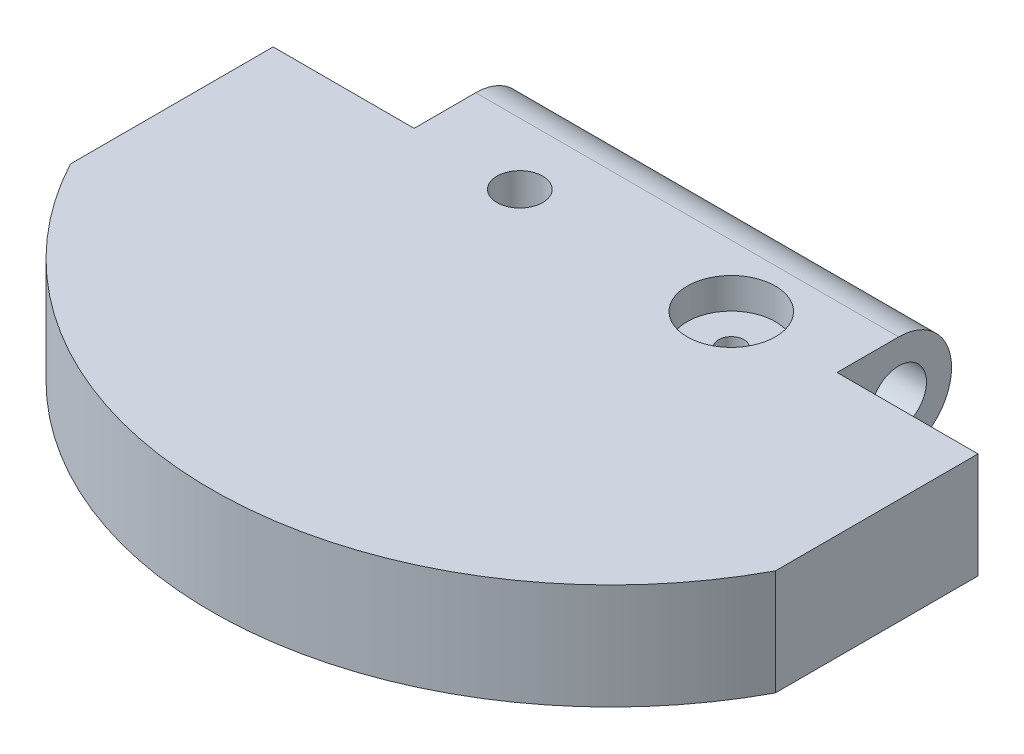
ISO-10303-21;
HEADER;
FILE_DESCRIPTION(('STEP AP214'),'2;1');
FILE_NAME('part.step','',(''),(''),'','','');
FILE_SCHEMA(('AUTOMOTIVE_DESIGN { 1 0 10303 214 1 1 1 1 }'));
ENDSEC;
DATA;
#1=APPLICATION_CONTEXT('core data for automotive mechanical design processes');
#2=APPLICATION_PROTOCOL_DEFINITION('international standard','automotive_design',2000,#1);
#3=PRODUCT_CONTEXT('',#1,'mechanical');
#4=PRODUCT('Part','Part','',(#3));
#5=PRODUCT_RELATED_PRODUCT_CATEGORY('part','',(#4));
#6=PRODUCT_DEFINITION_FORMATION('','',#4);
#7=PRODUCT_DEFINITION_CONTEXT('part definition',#1,'design');
#8=PRODUCT_DEFINITION('design','',#6,#7);
#9=PRODUCT_DEFINITION_SHAPE('','',#8);
#10=(LENGTH_UNIT() NAMED_UNIT(*) SI_UNIT(.MILLI.,.METRE.));
#11=(NAMED_UNIT(*) PLANE_ANGLE_UNIT() SI_UNIT($,.RADIAN.));
#12=(NAMED_UNIT(*) SI_UNIT($,.STERADIAN.) SOLID_ANGLE_UNIT());
#13=UNCERTAINTY_MEASURE_WITH_UNIT(LENGTH_MEASURE(1.E-05),#10,'distance_accuracy_value','');
#14=(GEOMETRIC_REPRESENTATION_CONTEXT(3) GLOBAL_UNCERTAINTY_ASSIGNED_CONTEXT((#13)) GLOBAL_UNIT_ASSIGNED_CONTEXT((#10,
#11,#12)) REPRESENTATION_CONTEXT('',''));
#15=CARTESIAN_POINT('',(0.,0.,0.));
#16=DIRECTION('',(0.,0.,1.));
#17=DIRECTION('',(1.,0.,0.));
#18=AXIS2_PLACEMENT_3D('',#15,#16,#17);
#19=CARTESIAN_POINT('',(-12.,-1.5,-17.));
#20=DIRECTION('',(0.,1.,0.));
#21=DIRECTION('',(0.,0.,1.));
#22=AXIS2_PLACEMENT_3D('',#19,#20,#21);
#23=CYLINDRICAL_SURFACE('',#22,1.45);
#24=CARTESIAN_POINT('',(-12.,3.5,-17.));
#25=DIRECTION('',(0.,1.,0.));
#26=DIRECTION('',(0.,0.,1.));
#27=AXIS2_PLACEMENT_3D('',#24,#25,#26);
#28=CIRCLE('',#27,1.45);
#29=CARTESIAN_POINT('',(-12.,3.5,-15.55));
#30=VERTEX_POINT('',#29);
#31=EDGE_CURVE('E169',#30,#30,#28,.T.);
#32=ORIENTED_EDGE('',*,*,#31,.F.);
#33=EDGE_LOOP('',(#32));
#34=FACE_BOUND('',#33,.T.);
#35=CARTESIAN_POINT('',(-12.,7.6,-17.));
#36=DIRECTION('',(0.,1.,0.));
#37=DIRECTION('',(0.,0.,1.));
#38=AXIS2_PLACEMENT_3D('',#35,#36,#37);
#39=CIRCLE('',#38,1.45);
#40=CARTESIAN_POINT('',(-12.,7.6,-15.55));
#41=VERTEX_POINT('',#40);
#42=EDGE_CURVE('E174',#41,#41,#39,.F.);
#43=ORIENTED_EDGE('',*,*,#42,.F.);
#44=EDGE_LOOP('',(#43));
#45=FACE_BOUND('',#44,.T.);
#46=ADVANCED_FACE('F44',(#34,#45),#23,.F.);
#47=CARTESIAN_POINT('',(0.,12.,-15.3333333333333));
#48=DIRECTION('',(0.,-1.,0.));
#49=DIRECTION('',(0.,0.,-1.));
#50=AXIS2_PLACEMENT_3D('',#47,#48,#49);
#51=CYLINDRICAL_SURFACE('',#50,45.3333333333333);
#52=CARTESIAN_POINT('',(0.,0.,-15.3333333333333));
#53=DIRECTION('',(0.,1.,0.));
#54=DIRECTION('',(0.,0.,1.));
#55=AXIS2_PLACEMENT_3D('',#52,#53,#54);
#56=CIRCLE('',#55,45.3333333333333);
#57=CARTESIAN_POINT('',(-40.,0.,5.99999999999999));
#58=VERTEX_POINT('',#57);
#59=CARTESIAN_POINT('',(40.,0.,5.99999999999999));
#60=VERTEX_POINT('',#59);
#61=EDGE_CURVE('E142',#58,#60,#56,.T.);
#62=ORIENTED_EDGE('',*,*,#61,.T.);
#63=DIRECTION('',(0.,-1.,0.));
#64=VECTOR('',#63,1.);
#65=CARTESIAN_POINT('',(40.,12.,5.99999999999999));
#66=LINE('',#65,#64);
#67=CARTESIAN_POINT('',(40.,12.,5.99999999999999));
#68=VERTEX_POINT('',#67);
#69=EDGE_CURVE('E122',#68,#60,#66,.T.);
#70=ORIENTED_EDGE('',*,*,#69,.F.);
#71=CARTESIAN_POINT('',(0.,12.,-15.3333333333333));
#72=DIRECTION('',(0.,1.,0.));
#73=DIRECTION('',(0.,0.,1.));
#74=AXIS2_PLACEMENT_3D('',#71,#72,#73);
#75=CIRCLE('',#74,45.3333333333333);
#76=CARTESIAN_POINT('',(-40.,12.,5.99999999999999));
#77=VERTEX_POINT('',#76);
#78=EDGE_CURVE('E129',#77,#68,#75,.T.);
#79=ORIENTED_EDGE('',*,*,#78,.F.);
#80=DIRECTION('',(0.,-1.,0.));
#81=VECTOR('',#80,1.);
#82=CARTESIAN_POINT('',(-40.,12.,5.99999999999999));
#83=LINE('',#82,#81);
#84=EDGE_CURVE('E240',#77,#58,#83,.T.);
#85=ORIENTED_EDGE('',*,*,#84,.T.);
#86=EDGE_LOOP('',(#62,#70,#79,#85));
#87=FACE_BOUND('',#86,.T.);
#88=ADVANCED_FACE('F140',(#87),#51,.T.);
#89=CARTESIAN_POINT('',(40.,12.,0.));
#90=DIRECTION('',(-1.,0.,0.));
#91=DIRECTION('',(0.,0.,1.));
#92=AXIS2_PLACEMENT_3D('',#89,#90,#91);
#93=PLANE('',#92);
#94=DIRECTION('',(0.,0.,-1.));
#95=VECTOR('',#94,1.);
#96=CARTESIAN_POINT('',(40.,0.,0.));
#97=LINE('',#96,#95);
#98=CARTESIAN_POINT('',(40.,0.,-17.));
#99=VERTEX_POINT('',#98);
#100=EDGE_CURVE('E243',#60,#99,#97,.T.);
#101=ORIENTED_EDGE('',*,*,#100,.T.);
#102=DIRECTION('',(0.,-1.,0.));
#103=VECTOR('',#102,1.);
#104=CARTESIAN_POINT('',(40.,12.,-17.));
#105=LINE('',#104,#103);
#106=CARTESIAN_POINT('',(40.,12.,-17.));
#107=VERTEX_POINT('',#106);
#108=EDGE_CURVE('E124',#107,#99,#105,.T.);
#109=ORIENTED_EDGE('',*,*,#108,.F.);
#110=DIRECTION('',(0.,0.,-1.));
#111=VECTOR('',#110,1.);
#112=CARTESIAN_POINT('',(40.,12.,0.));
#113=LINE('',#112,#111);
#114=EDGE_CURVE('E117',#68,#107,#113,.T.);
#115=ORIENTED_EDGE('',*,*,#114,.F.);
#116=ORIENTED_EDGE('',*,*,#69,.T.);
#117=EDGE_LOOP('',(#101,#109,#115,#116));
#118=FACE_BOUND('',#117,.T.);
#119=ADVANCED_FACE('F120',(#118),#93,.F.);
#120=CARTESIAN_POINT('',(0.,12.,-17.));
#121=DIRECTION('',(0.,0.,-1.));
#122=DIRECTION('',(-1.,0.,0.));
#123=AXIS2_PLACEMENT_3D('',#120,#121,#122);
#124=PLANE('',#123);
#125=DIRECTION('',(1.,0.,0.));
#126=VECTOR('',#125,1.);
#127=CARTESIAN_POINT('',(0.,0.,-17.));
#128=LINE('',#127,#126);
#129=CARTESIAN_POINT('',(24.,0.,-17.));
#130=VERTEX_POINT('',#129);
#131=EDGE_CURVE('E246',#130,#99,#128,.T.);
#132=ORIENTED_EDGE('',*,*,#131,.F.);
#133=DIRECTION('',(0.,-1.,0.));
#134=VECTOR('',#133,1.);
#135=CARTESIAN_POINT('',(24.,12.,-17.));
#136=LINE('',#135,#134);
#137=CARTESIAN_POINT('',(24.,12.,-17.));
#138=VERTEX_POINT('',#137);
#139=EDGE_CURVE('E151',#138,#130,#136,.T.);
#140=ORIENTED_EDGE('',*,*,#139,.F.);
#141=DIRECTION('',(1.,0.,0.));
#142=VECTOR('',#141,1.);
#143=CARTESIAN_POINT('',(0.,12.,-17.));
#144=LINE('',#143,#142);
#145=EDGE_CURVE('E128',#138,#107,#144,.T.);
#146=ORIENTED_EDGE('',*,*,#145,.T.);
#147=ORIENTED_EDGE('',*,*,#108,.T.);
#148=EDGE_LOOP('',(#132,#140,#146,#147));
#149=FACE_BOUND('',#148,.T.);
#150=ADVANCED_FACE('F279',(#149),#124,.T.);
#151=CARTESIAN_POINT('',(24.,12.,0.));
#152=DIRECTION('',(1.,0.,0.));
#153=DIRECTION('',(0.,0.,-1.));
#154=AXIS2_PLACEMENT_3D('',#151,#152,#153);
#155=PLANE('',#154);
#156=CARTESIAN_POINT('',(24.,6.,-24.));
#157=DIRECTION('',(1.,0.,0.));
#158=DIRECTION('',(0.,0.,-1.));
#159=AXIS2_PLACEMENT_3D('',#156,#157,#158);
#160=CIRCLE('',#159,3.15);
#161=CARTESIAN_POINT('',(24.,6.,-27.15));
#162=VERTEX_POINT('',#161);
#163=EDGE_CURVE('E168',#162,#162,#160,.T.);
#164=ORIENTED_EDGE('',*,*,#163,.F.);
#165=EDGE_LOOP('',(#164));
#166=FACE_BOUND('',#165,.T.);
#167=DIRECTION('',(0.,0.,1.));
#168=VECTOR('',#167,1.);
#169=CARTESIAN_POINT('',(24.,0.,0.));
#170=LINE('',#169,#168);
#171=CARTESIAN_POINT('',(24.,0.,-24.));
#172=VERTEX_POINT('',#171);
#173=EDGE_CURVE('E250',#172,#130,#170,.T.);
#174=ORIENTED_EDGE('',*,*,#173,.F.);
#175=CARTESIAN_POINT('',(24.,6.,-24.));
#176=DIRECTION('',(1.,0.,0.));
#177=DIRECTION('',(0.,0.,-1.));
#178=AXIS2_PLACEMENT_3D('',#175,#176,#177);
#179=CIRCLE('',#178,6.);
#180=CARTESIAN_POINT('',(24.,6.,-30.));
#181=VERTEX_POINT('',#180);
#182=EDGE_CURVE('E157',#172,#181,#179,.T.);
#183=ORIENTED_EDGE('',*,*,#182,.T.);
#184=CARTESIAN_POINT('',(24.,6.,-24.));
#185=DIRECTION('',(1.,0.,0.));
#186=DIRECTION('',(0.,0.,-1.));
#187=AXIS2_PLACEMENT_3D('',#184,#185,#186);
#188=CIRCLE('',#187,6.);
#189=CARTESIAN_POINT('',(24.,12.,-24.));
#190=VERTEX_POINT('',#189);
#191=EDGE_CURVE('E149',#181,#190,#188,.T.);
#192=ORIENTED_EDGE('',*,*,#191,.T.);
#193=DIRECTION('',(0.,0.,1.));
#194=VECTOR('',#193,1.);
#195=CARTESIAN_POINT('',(24.,12.,0.));
#196=LINE('',#195,#194);
#197=EDGE_CURVE('E229',#190,#138,#196,.T.);
#198=ORIENTED_EDGE('',*,*,#197,.T.);
#199=ORIENTED_EDGE('',*,*,#139,.T.);
#200=EDGE_LOOP('',(#174,#183,#192,#198,#199));
#201=FACE_BOUND('',#200,.T.);
#202=ADVANCED_FACE('F277',(#166,#201),#155,.T.);
#203=CARTESIAN_POINT('',(-24.,12.,0.));
#204=DIRECTION('',(1.,0.,0.));
#205=DIRECTION('',(0.,0.,-1.));
#206=AXIS2_PLACEMENT_3D('',#203,#204,#205);
#207=PLANE('',#206);
#208=CARTESIAN_POINT('',(-24.,6.,-24.));
#209=DIRECTION('',(-1.,0.,0.));
#210=DIRECTION('',(0.,0.,1.));
#211=AXIS2_PLACEMENT_3D('',#208,#209,#210);
#212=CIRCLE('',#211,3.15);
#213=CARTESIAN_POINT('',(-24.,6.,-20.85));
#214=VERTEX_POINT('',#213);
#215=EDGE_CURVE('E217',#214,#214,#212,.T.);
#216=ORIENTED_EDGE('',*,*,#215,.F.);
#217=EDGE_LOOP('',(#216));
#218=FACE_BOUND('',#217,.T.);
#219=CARTESIAN_POINT('',(-24.,6.,-24.));
#220=DIRECTION('',(1.,0.,0.));
#221=DIRECTION('',(0.,0.,-1.));
#222=AXIS2_PLACEMENT_3D('',#219,#220,#221);
#223=CIRCLE('',#222,6.);
#224=CARTESIAN_POINT('',(-24.,12.,-24.));
#225=VERTEX_POINT('',#224);
#226=CARTESIAN_POINT('',(-24.,6.,-30.));
#227=VERTEX_POINT('',#226);
#228=EDGE_CURVE('E62',#225,#227,#223,.F.);
#229=ORIENTED_EDGE('',*,*,#228,.T.);
#230=CARTESIAN_POINT('',(-24.,6.,-24.));
#231=DIRECTION('',(1.,0.,0.));
#232=DIRECTION('',(0.,0.,-1.));
#233=AXIS2_PLACEMENT_3D('',#230,#231,#232);
#234=CIRCLE('',#233,6.);
#235=CARTESIAN_POINT('',(-24.,0.,-24.));
#236=VERTEX_POINT('',#235);
#237=EDGE_CURVE('E54',#227,#236,#234,.F.);
#238=ORIENTED_EDGE('',*,*,#237,.T.);
#239=DIRECTION('',(0.,0.,1.));
#240=VECTOR('',#239,1.);
#241=CARTESIAN_POINT('',(-24.,0.,0.));
#242=LINE('',#241,#240);
#243=CARTESIAN_POINT('',(-24.,0.,-17.));
#244=VERTEX_POINT('',#243);
#245=EDGE_CURVE('E253',#236,#244,#242,.T.);
#246=ORIENTED_EDGE('',*,*,#245,.T.);
#247=DIRECTION('',(0.,-1.,0.));
#248=VECTOR('',#247,1.);
#249=CARTESIAN_POINT('',(-24.,12.,-17.));
#250=LINE('',#249,#248);
#251=CARTESIAN_POINT('',(-24.,12.,-17.));
#252=VERTEX_POINT('',#251);
#253=EDGE_CURVE('E268',#252,#244,#250,.T.);
#254=ORIENTED_EDGE('',*,*,#253,.F.);
#255=DIRECTION('',(0.,0.,1.));
#256=VECTOR('',#255,1.);
#257=CARTESIAN_POINT('',(-24.,12.,0.));
#258=LINE('',#257,#256);
#259=EDGE_CURVE('E232',#225,#252,#258,.T.);
#260=ORIENTED_EDGE('',*,*,#259,.F.);
#261=EDGE_LOOP('',(#229,#238,#246,#254,#260));
#262=FACE_BOUND('',#261,.T.);
#263=ADVANCED_FACE('F334',(#218,#262),#207,.F.);
#264=CARTESIAN_POINT('',(0.,12.,-17.));
#265=DIRECTION('',(0.,0.,1.));
#266=DIRECTION('',(1.,0.,0.));
#267=AXIS2_PLACEMENT_3D('',#264,#265,#266);
#268=PLANE('',#267);
#269=DIRECTION('',(-1.,0.,0.));
#270=VECTOR('',#269,1.);
#271=CARTESIAN_POINT('',(0.,0.,-17.));
#272=LINE('',#271,#270);
#273=CARTESIAN_POINT('',(-40.,0.,-17.));
#274=VERTEX_POINT('',#273);
#275=EDGE_CURVE('E256',#244,#274,#272,.T.);
#276=ORIENTED_EDGE('',*,*,#275,.T.);
#277=DIRECTION('',(0.,-1.,0.));
#278=VECTOR('',#277,1.);
#279=CARTESIAN_POINT('',(-40.,12.,-17.));
#280=LINE('',#279,#278);
#281=CARTESIAN_POINT('',(-40.,12.,-17.));
#282=VERTEX_POINT('',#281);
#283=EDGE_CURVE('E265',#282,#274,#280,.T.);
#284=ORIENTED_EDGE('',*,*,#283,.F.);
#285=DIRECTION('',(-1.,0.,0.));
#286=VECTOR('',#285,1.);
#287=CARTESIAN_POINT('',(0.,12.,-17.));
#288=LINE('',#287,#286);
#289=EDGE_CURVE('E235',#252,#282,#288,.T.);
#290=ORIENTED_EDGE('',*,*,#289,.F.);
#291=ORIENTED_EDGE('',*,*,#253,.T.);
#292=EDGE_LOOP('',(#276,#284,#290,#291));
#293=FACE_BOUND('',#292,.T.);
#294=ADVANCED_FACE('F330',(#293),#268,.F.);
#295=CARTESIAN_POINT('',(-40.,12.,0.));
#296=DIRECTION('',(-1.,0.,0.));
#297=DIRECTION('',(0.,0.,1.));
#298=AXIS2_PLACEMENT_3D('',#295,#296,#297);
#299=PLANE('',#298);
#300=DIRECTION('',(0.,0.,-1.));
#301=VECTOR('',#300,1.);
#302=CARTESIAN_POINT('',(-40.,0.,0.));
#303=LINE('',#302,#301);
#304=EDGE_CURVE('E138',#58,#274,#303,.T.);
#305=ORIENTED_EDGE('',*,*,#304,.F.);
#306=ORIENTED_EDGE('',*,*,#84,.F.);
#307=DIRECTION('',(0.,0.,-1.));
#308=VECTOR('',#307,1.);
#309=CARTESIAN_POINT('',(-40.,12.,0.));
#310=LINE('',#309,#308);
#311=EDGE_CURVE('E135',#77,#282,#310,.T.);
#312=ORIENTED_EDGE('',*,*,#311,.T.);
#313=ORIENTED_EDGE('',*,*,#283,.T.);
#314=EDGE_LOOP('',(#305,#306,#312,#313));
#315=FACE_BOUND('',#314,.T.);
#316=ADVANCED_FACE('F325',(#315),#299,.T.);
#317=CARTESIAN_POINT('',(0.,12.,0.));
#318=DIRECTION('',(0.,1.,0.));
#319=DIRECTION('',(0.,0.,1.));
#320=AXIS2_PLACEMENT_3D('',#317,#318,#319);
#321=PLANE('',#320);
#322=CARTESIAN_POINT('',(12.,12.,-17.));
#323=DIRECTION('',(0.,1.,0.));
#324=DIRECTION('',(0.,0.,1.));
#325=AXIS2_PLACEMENT_3D('',#322,#323,#324);
#326=CIRCLE('',#325,5.);
#327=CARTESIAN_POINT('',(12.,12.,-12.));
#328=VERTEX_POINT('',#327);
#329=EDGE_CURVE('E181',#328,#328,#326,.T.);
#330=ORIENTED_EDGE('',*,*,#329,.F.);
#331=EDGE_LOOP('',(#330));
#332=FACE_BOUND('',#331,.T.);
#333=CARTESIAN_POINT('',(-12.,12.,-17.));
#334=DIRECTION('',(0.,1.,0.));
#335=DIRECTION('',(0.,0.,1.));
#336=AXIS2_PLACEMENT_3D('',#333,#334,#335);
#337=CIRCLE('',#336,2.6);
#338=CARTESIAN_POINT('',(-12.,12.,-14.4));
#339=VERTEX_POINT('',#338);
#340=EDGE_CURVE('E205',#339,#339,#337,.T.);
#341=ORIENTED_EDGE('',*,*,#340,.F.);
#342=EDGE_LOOP('',(#341));
#343=FACE_BOUND('',#342,.T.);
#344=ORIENTED_EDGE('',*,*,#197,.F.);
#345=DIRECTION('',(1.,0.,0.));
#346=VECTOR('',#345,1.);
#347=CARTESIAN_POINT('',(0.,12.,-24.));
#348=LINE('',#347,#346);
#349=EDGE_CURVE('E11',#190,#225,#348,.F.);
#350=ORIENTED_EDGE('',*,*,#349,.T.);
#351=ORIENTED_EDGE('',*,*,#259,.T.);
#352=ORIENTED_EDGE('',*,*,#289,.T.);
#353=ORIENTED_EDGE('',*,*,#311,.F.);
#354=ORIENTED_EDGE('',*,*,#78,.T.);
#355=ORIENTED_EDGE('',*,*,#114,.T.);
#356=ORIENTED_EDGE('',*,*,#145,.F.);
#357=EDGE_LOOP('',(#344,#350,#351,#352,#353,#354,#355,#356));
#358=FACE_BOUND('',#357,.T.);
#359=ADVANCED_FACE('F133',(#332,#343,#358),#321,.T.);
#360=CARTESIAN_POINT('',(0.,0.,0.));
#361=DIRECTION('',(0.,1.,0.));
#362=DIRECTION('',(0.,0.,1.));
#363=AXIS2_PLACEMENT_3D('',#360,#361,#362);
#364=PLANE('',#363);
#365=CARTESIAN_POINT('',(12.,0.,-17.));
#366=DIRECTION('',(0.,1.,0.));
#367=DIRECTION('',(0.,0.,1.));
#368=AXIS2_PLACEMENT_3D('',#365,#366,#367);
#369=CIRCLE('',#368,2.6);
#370=CARTESIAN_POINT('',(12.,0.,-14.4));
#371=VERTEX_POINT('',#370);
#372=EDGE_CURVE('E195',#371,#371,#369,.T.);
#373=ORIENTED_EDGE('',*,*,#372,.T.);
#374=EDGE_LOOP('',(#373));
#375=FACE_BOUND('',#374,.T.);
#376=CARTESIAN_POINT('',(-12.,0.,-17.));
#377=DIRECTION('',(0.,1.,0.));
#378=DIRECTION('',(0.,0.,1.));
#379=AXIS2_PLACEMENT_3D('',#376,#377,#378);
#380=CIRCLE('',#379,5.);
#381=CARTESIAN_POINT('',(-12.,0.,-12.));
#382=VERTEX_POINT('',#381);
#383=EDGE_CURVE('E173',#382,#382,#380,.T.);
#384=ORIENTED_EDGE('',*,*,#383,.T.);
#385=EDGE_LOOP('',(#384));
#386=FACE_BOUND('',#385,.T.);
#387=ORIENTED_EDGE('',*,*,#245,.F.);
#388=DIRECTION('',(1.,0.,0.));
#389=VECTOR('',#388,1.);
#390=CARTESIAN_POINT('',(24.,0.,-24.));
#391=LINE('',#390,#389);
#392=EDGE_CURVE('E144',#236,#172,#391,.T.);
#393=ORIENTED_EDGE('',*,*,#392,.T.);
#394=ORIENTED_EDGE('',*,*,#173,.T.);
#395=ORIENTED_EDGE('',*,*,#131,.T.);
#396=ORIENTED_EDGE('',*,*,#100,.F.);
#397=ORIENTED_EDGE('',*,*,#61,.F.);
#398=ORIENTED_EDGE('',*,*,#304,.T.);
#399=ORIENTED_EDGE('',*,*,#275,.F.);
#400=EDGE_LOOP('',(#387,#393,#394,#395,#396,#397,#398,#399));
#401=FACE_BOUND('',#400,.T.);
#402=ADVANCED_FACE('F282',(#375,#386,#401),#364,.F.);
#403=CARTESIAN_POINT('',(0.,6.,-24.));
#404=DIRECTION('',(1.,0.,0.));
#405=DIRECTION('',(0.,0.,-1.));
#406=AXIS2_PLACEMENT_3D('',#403,#404,#405);
#407=CYLINDRICAL_SURFACE('',#406,6.);
#408=DIRECTION('',(1.,0.,0.));
#409=VECTOR('',#408,1.);
#410=CARTESIAN_POINT('',(0.,6.,-30.));
#411=LINE('',#410,#409);
#412=EDGE_CURVE('E164',#227,#181,#411,.T.);
#413=ORIENTED_EDGE('',*,*,#412,.F.);
#414=ORIENTED_EDGE('',*,*,#228,.F.);
#415=ORIENTED_EDGE('',*,*,#349,.F.);
#416=ORIENTED_EDGE('',*,*,#191,.F.);
#417=EDGE_LOOP('',(#413,#414,#415,#416));
#418=FACE_BOUND('',#417,.T.);
#419=ADVANCED_FACE('F46',(#418),#407,.T.);
#420=CARTESIAN_POINT('',(0.,6.,-24.));
#421=DIRECTION('',(-1.,0.,0.));
#422=DIRECTION('',(0.,0.,1.));
#423=AXIS2_PLACEMENT_3D('',#420,#421,#422);
#424=CYLINDRICAL_SURFACE('',#423,6.);
#425=ORIENTED_EDGE('',*,*,#237,.F.);
#426=ORIENTED_EDGE('',*,*,#412,.T.);
#427=ORIENTED_EDGE('',*,*,#182,.F.);
#428=ORIENTED_EDGE('',*,*,#392,.F.);
#429=EDGE_LOOP('',(#425,#426,#427,#428));
#430=FACE_BOUND('',#429,.T.);
#431=ADVANCED_FACE('F287',(#430),#424,.T.);
#432=CARTESIAN_POINT('',(46.,6.,-24.));
#433=DIRECTION('',(-1.,0.,0.));
#434=DIRECTION('',(0.,0.,1.));
#435=AXIS2_PLACEMENT_3D('',#432,#433,#434);
#436=CYLINDRICAL_SURFACE('',#435,3.15);
#437=ORIENTED_EDGE('',*,*,#163,.T.);
#438=EDGE_LOOP('',(#437));
#439=FACE_BOUND('',#438,.T.);
#440=ORIENTED_EDGE('',*,*,#215,.T.);
#441=EDGE_LOOP('',(#440));
#442=FACE_BOUND('',#441,.T.);
#443=ADVANCED_FACE('F295',(#439,#442),#436,.F.);
#444=CARTESIAN_POINT('',(-12.,3.5,-17.));
#445=DIRECTION('',(0.,-1.,0.));
#446=DIRECTION('',(0.,0.,-1.));
#447=AXIS2_PLACEMENT_3D('',#444,#445,#446);
#448=CYLINDRICAL_SURFACE('',#447,5.);
#449=CARTESIAN_POINT('',(-12.,3.5,-17.));
#450=DIRECTION('',(0.,1.,0.));
#451=DIRECTION('',(0.,0.,1.));
#452=AXIS2_PLACEMENT_3D('',#449,#450,#451);
#453=CIRCLE('',#452,5.);
#454=CARTESIAN_POINT('',(-12.,3.5,-12.));
#455=VERTEX_POINT('',#454);
#456=EDGE_CURVE('E213',#455,#455,#453,.T.);
#457=ORIENTED_EDGE('',*,*,#456,.T.);
#458=EDGE_LOOP('',(#457));
#459=FACE_BOUND('',#458,.T.);
#460=ORIENTED_EDGE('',*,*,#383,.F.);
#461=EDGE_LOOP('',(#460));
#462=FACE_BOUND('',#461,.T.);
#463=ADVANCED_FACE('F318',(#459,#462),#448,.F.);
#464=CARTESIAN_POINT('',(-12.,3.5,-17.));
#465=DIRECTION('',(0.,1.,0.));
#466=DIRECTION('',(0.,0.,1.));
#467=AXIS2_PLACEMENT_3D('',#464,#465,#466);
#468=PLANE('',#467);
#469=ORIENTED_EDGE('',*,*,#31,.T.);
#470=EDGE_LOOP('',(#469));
#471=FACE_BOUND('',#470,.T.);
#472=ORIENTED_EDGE('',*,*,#456,.F.);
#473=EDGE_LOOP('',(#472));
#474=FACE_BOUND('',#473,.T.);
#475=ADVANCED_FACE('F314',(#471,#474),#468,.F.);
#476=CARTESIAN_POINT('',(-12.,7.6,-17.));
#477=DIRECTION('',(0.,1.,0.));
#478=DIRECTION('',(0.,0.,1.));
#479=AXIS2_PLACEMENT_3D('',#476,#477,#478);
#480=PLANE('',#479);
#481=CARTESIAN_POINT('',(-12.,7.6,-17.));
#482=DIRECTION('',(0.,1.,0.));
#483=DIRECTION('',(0.,0.,1.));
#484=AXIS2_PLACEMENT_3D('',#481,#482,#483);
#485=CIRCLE('',#484,2.6);
#486=CARTESIAN_POINT('',(-12.,7.6,-14.4));
#487=VERTEX_POINT('',#486);
#488=EDGE_CURVE('E177',#487,#487,#485,.T.);
#489=ORIENTED_EDGE('',*,*,#488,.T.);
#490=EDGE_LOOP('',(#489));
#491=FACE_BOUND('',#490,.T.);
#492=ORIENTED_EDGE('',*,*,#42,.T.);
#493=EDGE_LOOP('',(#492));
#494=FACE_BOUND('',#493,.T.);
#495=ADVANCED_FACE('F317',(#491,#494),#480,.T.);
#496=CARTESIAN_POINT('',(-12.,7.6,-17.));
#497=DIRECTION('',(0.,1.,0.));
#498=DIRECTION('',(0.,0.,1.));
#499=AXIS2_PLACEMENT_3D('',#496,#497,#498);
#500=CYLINDRICAL_SURFACE('',#499,2.6);
#501=ORIENTED_EDGE('',*,*,#488,.F.);
#502=EDGE_LOOP('',(#501));
#503=FACE_BOUND('',#502,.T.);
#504=ORIENTED_EDGE('',*,*,#340,.T.);
#505=EDGE_LOOP('',(#504));
#506=FACE_BOUND('',#505,.T.);
#507=ADVANCED_FACE('F312',(#503,#506),#500,.F.);
#508=CARTESIAN_POINT('',(12.,8.5,-17.));
#509=DIRECTION('',(0.,1.,0.));
#510=DIRECTION('',(0.,0.,1.));
#511=AXIS2_PLACEMENT_3D('',#508,#509,#510);
#512=CYLINDRICAL_SURFACE('',#511,5.);
#513=CARTESIAN_POINT('',(12.,8.5,-17.));
#514=DIRECTION('',(0.,1.,0.));
#515=DIRECTION('',(0.,0.,1.));
#516=AXIS2_PLACEMENT_3D('',#513,#514,#515);
#517=CIRCLE('',#516,5.);
#518=CARTESIAN_POINT('',(12.,8.5,-12.));
#519=VERTEX_POINT('',#518);
#520=EDGE_CURVE('E187',#519,#519,#517,.T.);
#521=ORIENTED_EDGE('',*,*,#520,.F.);
#522=EDGE_LOOP('',(#521));
#523=FACE_BOUND('',#522,.T.);
#524=ORIENTED_EDGE('',*,*,#329,.T.);
#525=EDGE_LOOP('',(#524));
#526=FACE_BOUND('',#525,.T.);
#527=ADVANCED_FACE('F423',(#523,#526),#512,.F.);
#528=CARTESIAN_POINT('',(12.,8.5,-17.));
#529=DIRECTION('',(0.,1.,0.));
#530=DIRECTION('',(0.,0.,1.));
#531=AXIS2_PLACEMENT_3D('',#528,#529,#530);
#532=PLANE('',#531);
#533=CARTESIAN_POINT('',(12.,8.5,-17.));
#534=DIRECTION('',(0.,1.,0.));
#535=DIRECTION('',(0.,0.,1.));
#536=AXIS2_PLACEMENT_3D('',#533,#534,#535);
#537=CIRCLE('',#536,1.45);
#538=CARTESIAN_POINT('',(12.,8.5,-15.55));
#539=VERTEX_POINT('',#538);
#540=EDGE_CURVE('E178',#539,#539,#537,.T.);
#541=ORIENTED_EDGE('',*,*,#540,.F.);
#542=EDGE_LOOP('',(#541));
#543=FACE_BOUND('',#542,.T.);
#544=ORIENTED_EDGE('',*,*,#520,.T.);
#545=EDGE_LOOP('',(#544));
#546=FACE_BOUND('',#545,.T.);
#547=ADVANCED_FACE('F389',(#543,#546),#532,.T.);
#548=CARTESIAN_POINT('',(12.,-6.00000000000001,-17.));
#549=DIRECTION('',(0.,1.,0.));
#550=DIRECTION('',(0.,0.,1.));
#551=AXIS2_PLACEMENT_3D('',#548,#549,#550);
#552=CYLINDRICAL_SURFACE('',#551,1.45);
#553=CARTESIAN_POINT('',(12.,4.4,-17.));
#554=DIRECTION('',(0.,1.,0.));
#555=DIRECTION('',(0.,0.,1.));
#556=AXIS2_PLACEMENT_3D('',#553,#554,#555);
#557=CIRCLE('',#556,1.45);
#558=CARTESIAN_POINT('',(12.,4.4,-15.55));
#559=VERTEX_POINT('',#558);
#560=EDGE_CURVE('E48',#559,#559,#557,.F.);
#561=ORIENTED_EDGE('',*,*,#560,.T.);
#562=EDGE_LOOP('',(#561));
#563=FACE_BOUND('',#562,.T.);
#564=ORIENTED_EDGE('',*,*,#540,.T.);
#565=EDGE_LOOP('',(#564));
#566=FACE_BOUND('',#565,.T.);
#567=ADVANCED_FACE('F393',(#563,#566),#552,.F.);
#568=CARTESIAN_POINT('',(12.,4.4,-17.));
#569=DIRECTION('',(0.,1.,0.));
#570=DIRECTION('',(0.,0.,1.));
#571=AXIS2_PLACEMENT_3D('',#568,#569,#570);
#572=PLANE('',#571);
#573=CARTESIAN_POINT('',(12.,4.4,-17.));
#574=DIRECTION('',(0.,1.,0.));
#575=DIRECTION('',(0.,0.,1.));
#576=AXIS2_PLACEMENT_3D('',#573,#574,#575);
#577=CIRCLE('',#576,2.6);
#578=CARTESIAN_POINT('',(12.,4.4,-14.4));
#579=VERTEX_POINT('',#578);
#580=EDGE_CURVE('E190',#579,#579,#577,.T.);
#581=ORIENTED_EDGE('',*,*,#580,.F.);
#582=EDGE_LOOP('',(#581));
#583=FACE_BOUND('',#582,.T.);
#584=ORIENTED_EDGE('',*,*,#560,.F.);
#585=EDGE_LOOP('',(#584));
#586=FACE_BOUND('',#585,.T.);
#587=ADVANCED_FACE('F398',(#583,#586),#572,.F.);
#588=CARTESIAN_POINT('',(12.,4.4,-17.));
#589=DIRECTION('',(0.,-1.,0.));
#590=DIRECTION('',(0.,0.,-1.));
#591=AXIS2_PLACEMENT_3D('',#588,#589,#590);
#592=CYLINDRICAL_SURFACE('',#591,2.6);
#593=ORIENTED_EDGE('',*,*,#580,.T.);
#594=EDGE_LOOP('',(#593));
#595=FACE_BOUND('',#594,.T.);
#596=ORIENTED_EDGE('',*,*,#372,.F.);
#597=EDGE_LOOP('',(#596));
#598=FACE_BOUND('',#597,.T.);
#599=ADVANCED_FACE('F407',(#595,#598),#592,.F.);
#600=CLOSED_SHELL('',(#46,#88,#119,#150,#202,#263,#294,#316,#359,#402,#419,#431,#443,#463,#475,
#495,#507,#527,#547,#567,#587,#599));
#601=MANIFOLD_SOLID_BREP('B2',#600);
#602=ADVANCED_BREP_SHAPE_REPRESENTATION('',(#18,#601),#14);
#603=SHAPE_DEFINITION_REPRESENTATION(#9,#602);
ENDSEC;
END-ISO-10303-21;
